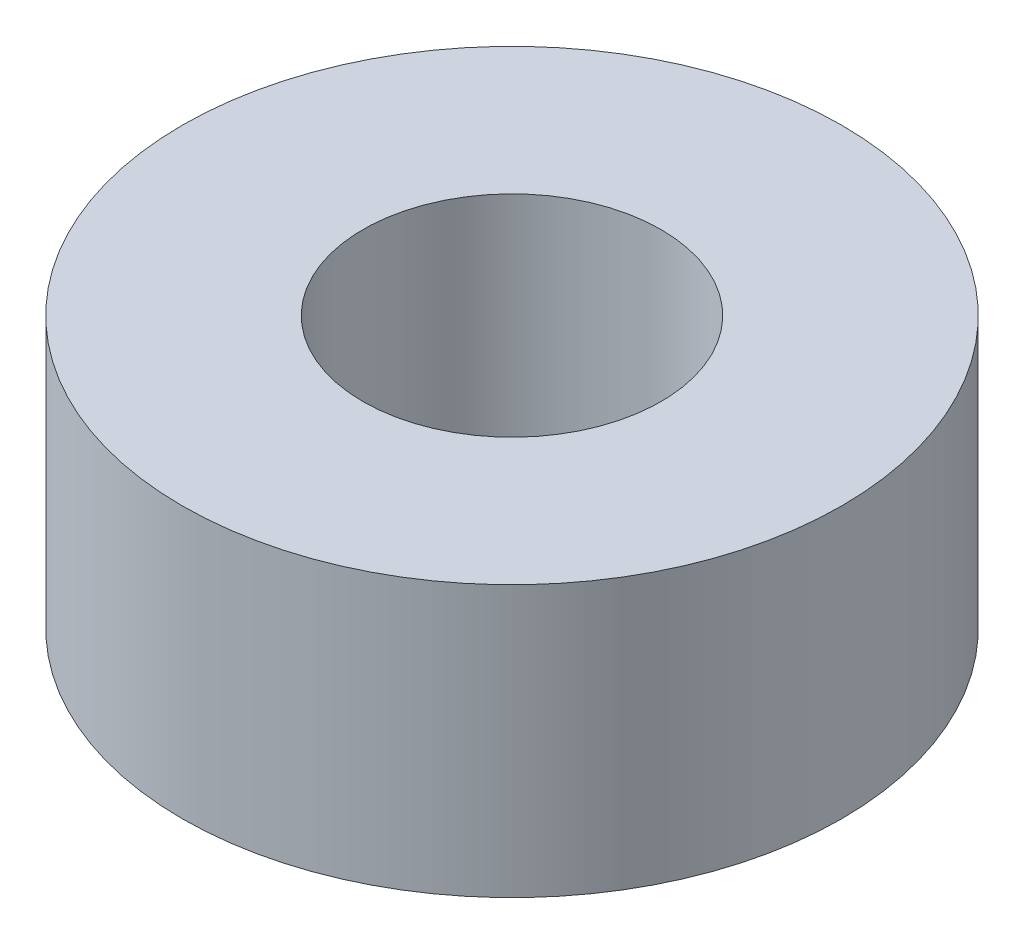
ISO-10303-21;
HEADER;
FILE_DESCRIPTION(('STEP AP214'),'2;1');
FILE_NAME('part.step','',(''),(''),'','','');
FILE_SCHEMA(('AUTOMOTIVE_DESIGN { 1 0 10303 214 1 1 1 1 }'));
ENDSEC;
DATA;
#1=APPLICATION_CONTEXT('core data for automotive mechanical design processes');
#2=APPLICATION_PROTOCOL_DEFINITION('international standard','automotive_design',2000,#1);
#3=PRODUCT_CONTEXT('',#1,'mechanical');
#4=PRODUCT('Part','Part','',(#3));
#5=PRODUCT_RELATED_PRODUCT_CATEGORY('part','',(#4));
#6=PRODUCT_DEFINITION_FORMATION('','',#4);
#7=PRODUCT_DEFINITION_CONTEXT('part definition',#1,'design');
#8=PRODUCT_DEFINITION('design','',#6,#7);
#9=PRODUCT_DEFINITION_SHAPE('','',#8);
#10=(LENGTH_UNIT() NAMED_UNIT(*) SI_UNIT(.MILLI.,.METRE.));
#11=(NAMED_UNIT(*) PLANE_ANGLE_UNIT() SI_UNIT($,.RADIAN.));
#12=(NAMED_UNIT(*) SI_UNIT($,.STERADIAN.) SOLID_ANGLE_UNIT());
#13=UNCERTAINTY_MEASURE_WITH_UNIT(LENGTH_MEASURE(1.E-05),#10,'distance_accuracy_value','');
#14=(GEOMETRIC_REPRESENTATION_CONTEXT(3) GLOBAL_UNCERTAINTY_ASSIGNED_CONTEXT((#13)) GLOBAL_UNIT_ASSIGNED_CONTEXT((#10,
#11,#12)) REPRESENTATION_CONTEXT('',''));
#15=CARTESIAN_POINT('',(0.,0.,0.));
#16=DIRECTION('',(0.,0.,1.));
#17=DIRECTION('',(1.,0.,0.));
#18=AXIS2_PLACEMENT_3D('',#15,#16,#17);
#19=CARTESIAN_POINT('',(0.,3.,0.));
#20=DIRECTION('',(0.,1.,0.));
#21=DIRECTION('',(0.,0.,1.));
#22=AXIS2_PLACEMENT_3D('',#19,#20,#21);
#23=PLANE('',#22);
#24=CARTESIAN_POINT('',(0.,3.,0.));
#25=DIRECTION('',(0.,1.,0.));
#26=DIRECTION('',(0.,0.,1.));
#27=AXIS2_PLACEMENT_3D('',#24,#25,#26);
#28=CIRCLE('',#27,3.65);
#29=CARTESIAN_POINT('',(0.,3.,3.65));
#30=VERTEX_POINT('',#29);
#31=EDGE_CURVE('E10',#30,#30,#28,.T.);
#32=ORIENTED_EDGE('',*,*,#31,.T.);
#33=EDGE_LOOP('',(#32));
#34=FACE_BOUND('',#33,.T.);
#35=CARTESIAN_POINT('',(0.,3.,0.));
#36=DIRECTION('',(0.,1.,0.));
#37=DIRECTION('',(0.,0.,1.));
#38=AXIS2_PLACEMENT_3D('',#35,#36,#37);
#39=CIRCLE('',#38,1.65);
#40=CARTESIAN_POINT('',(0.,3.,1.65));
#41=VERTEX_POINT('',#40);
#42=EDGE_CURVE('E44',#41,#41,#39,.T.);
#43=ORIENTED_EDGE('',*,*,#42,.F.);
#44=EDGE_LOOP('',(#43));
#45=FACE_BOUND('',#44,.T.);
#46=ADVANCED_FACE('F33',(#34,#45),#23,.T.);
#47=CARTESIAN_POINT('',(0.,0.,0.));
#48=DIRECTION('',(0.,1.,0.));
#49=DIRECTION('',(0.,0.,1.));
#50=AXIS2_PLACEMENT_3D('',#47,#48,#49);
#51=PLANE('',#50);
#52=CARTESIAN_POINT('',(0.,0.,0.));
#53=DIRECTION('',(0.,1.,0.));
#54=DIRECTION('',(0.,0.,1.));
#55=AXIS2_PLACEMENT_3D('',#52,#53,#54);
#56=CIRCLE('',#55,3.65);
#57=CARTESIAN_POINT('',(0.,0.,3.65));
#58=VERTEX_POINT('',#57);
#59=EDGE_CURVE('E37',#58,#58,#56,.T.);
#60=ORIENTED_EDGE('',*,*,#59,.F.);
#61=EDGE_LOOP('',(#60));
#62=FACE_BOUND('',#61,.T.);
#63=CARTESIAN_POINT('',(0.,0.,0.));
#64=DIRECTION('',(0.,1.,0.));
#65=DIRECTION('',(0.,0.,1.));
#66=AXIS2_PLACEMENT_3D('',#63,#64,#65);
#67=CIRCLE('',#66,1.65);
#68=CARTESIAN_POINT('',(0.,0.,1.65));
#69=VERTEX_POINT('',#68);
#70=EDGE_CURVE('E46',#69,#69,#67,.T.);
#71=ORIENTED_EDGE('',*,*,#70,.T.);
#72=EDGE_LOOP('',(#71));
#73=FACE_BOUND('',#72,.T.);
#74=ADVANCED_FACE('F56',(#62,#73),#51,.F.);
#75=CARTESIAN_POINT('',(0.,3.,0.));
#76=DIRECTION('',(0.,-1.,0.));
#77=DIRECTION('',(0.,0.,-1.));
#78=AXIS2_PLACEMENT_3D('',#75,#76,#77);
#79=CYLINDRICAL_SURFACE('',#78,3.65);
#80=ORIENTED_EDGE('',*,*,#31,.F.);
#81=EDGE_LOOP('',(#80));
#82=FACE_BOUND('',#81,.T.);
#83=ORIENTED_EDGE('',*,*,#59,.T.);
#84=EDGE_LOOP('',(#83));
#85=FACE_BOUND('',#84,.T.);
#86=ADVANCED_FACE('F35',(#82,#85),#79,.T.);
#87=CARTESIAN_POINT('',(0.,3.,0.));
#88=DIRECTION('',(0.,-1.,0.));
#89=DIRECTION('',(0.,0.,-1.));
#90=AXIS2_PLACEMENT_3D('',#87,#88,#89);
#91=CYLINDRICAL_SURFACE('',#90,1.65);
#92=ORIENTED_EDGE('',*,*,#42,.T.);
#93=EDGE_LOOP('',(#92));
#94=FACE_BOUND('',#93,.T.);
#95=ORIENTED_EDGE('',*,*,#70,.F.);
#96=EDGE_LOOP('',(#95));
#97=FACE_BOUND('',#96,.T.);
#98=ADVANCED_FACE('F52',(#94,#97),#91,.F.);
#99=CLOSED_SHELL('',(#46,#74,#86,#98));
#100=MANIFOLD_SOLID_BREP('B2',#99);
#101=ADVANCED_BREP_SHAPE_REPRESENTATION('',(#18,#100),#14);
#102=SHAPE_DEFINITION_REPRESENTATION(#9,#101);
ENDSEC;
END-ISO-10303-21;
